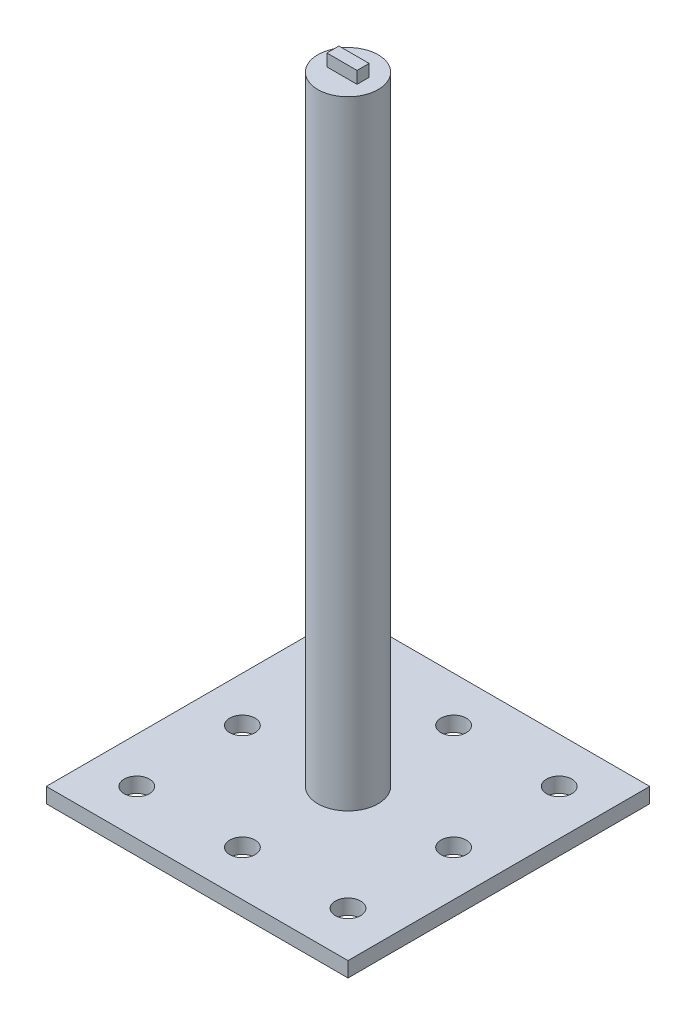
ISO-10303-21;
HEADER;
FILE_DESCRIPTION(('STEP AP214'),'2;1');
FILE_NAME('part.step','',(''),(''),'','','');
FILE_SCHEMA(('AUTOMOTIVE_DESIGN { 1 0 10303 214 1 1 1 1 }'));
ENDSEC;
DATA;
#1=APPLICATION_CONTEXT('core data for automotive mechanical design processes');
#2=APPLICATION_PROTOCOL_DEFINITION('international standard','automotive_design',2000,#1);
#3=PRODUCT_CONTEXT('',#1,'mechanical');
#4=PRODUCT('Part','Part','',(#3));
#5=PRODUCT_RELATED_PRODUCT_CATEGORY('part','',(#4));
#6=PRODUCT_DEFINITION_FORMATION('','',#4);
#7=PRODUCT_DEFINITION_CONTEXT('part definition',#1,'design');
#8=PRODUCT_DEFINITION('design','',#6,#7);
#9=PRODUCT_DEFINITION_SHAPE('','',#8);
#10=(LENGTH_UNIT() NAMED_UNIT(*) SI_UNIT(.MILLI.,.METRE.));
#11=(NAMED_UNIT(*) PLANE_ANGLE_UNIT() SI_UNIT($,.RADIAN.));
#12=(NAMED_UNIT(*) SI_UNIT($,.STERADIAN.) SOLID_ANGLE_UNIT());
#13=UNCERTAINTY_MEASURE_WITH_UNIT(LENGTH_MEASURE(1.E-05),#10,'distance_accuracy_value','');
#14=(GEOMETRIC_REPRESENTATION_CONTEXT(3) GLOBAL_UNCERTAINTY_ASSIGNED_CONTEXT((#13)) GLOBAL_UNIT_ASSIGNED_CONTEXT((#10,
#11,#12)) REPRESENTATION_CONTEXT('',''));
#15=CARTESIAN_POINT('',(0.,0.,0.));
#16=DIRECTION('',(0.,0.,1.));
#17=DIRECTION('',(1.,0.,0.));
#18=AXIS2_PLACEMENT_3D('',#15,#16,#17);
#19=CARTESIAN_POINT('',(0.,102.5,0.));
#20=DIRECTION('',(0.,1.,0.));
#21=DIRECTION('',(0.,0.,1.));
#22=AXIS2_PLACEMENT_3D('',#19,#20,#21);
#23=PLANE('',#22);
#24=CARTESIAN_POINT('',(0.,102.5,0.));
#25=DIRECTION('',(0.,1.,0.));
#26=DIRECTION('',(0.,0.,1.));
#27=AXIS2_PLACEMENT_3D('',#24,#25,#26);
#28=CIRCLE('',#27,5.);
#29=CARTESIAN_POINT('',(0.,102.5,5.));
#30=VERTEX_POINT('',#29);
#31=EDGE_CURVE('E221',#30,#30,#28,.T.);
#32=ORIENTED_EDGE('',*,*,#31,.T.);
#33=EDGE_LOOP('',(#32));
#34=FACE_BOUND('',#33,.T.);
#35=DIRECTION('',(-1.,0.,0.));
#36=VECTOR('',#35,1.);
#37=CARTESIAN_POINT('',(-2.5,102.5,-1.));
#38=LINE('',#37,#36);
#39=CARTESIAN_POINT('',(2.5,102.5,-1.));
#40=VERTEX_POINT('',#39);
#41=CARTESIAN_POINT('',(-2.5,102.5,-1.));
#42=VERTEX_POINT('',#41);
#43=EDGE_CURVE('E479',#40,#42,#38,.T.);
#44=ORIENTED_EDGE('',*,*,#43,.F.);
#45=DIRECTION('',(0.,0.,-1.));
#46=VECTOR('',#45,1.);
#47=CARTESIAN_POINT('',(2.5,102.5,-1.));
#48=LINE('',#47,#46);
#49=CARTESIAN_POINT('',(2.5,102.5,1.));
#50=VERTEX_POINT('',#49);
#51=EDGE_CURVE('E141',#50,#40,#48,.T.);
#52=ORIENTED_EDGE('',*,*,#51,.F.);
#53=DIRECTION('',(1.,0.,0.));
#54=VECTOR('',#53,1.);
#55=CARTESIAN_POINT('',(-2.5,102.5,1.));
#56=LINE('',#55,#54);
#57=CARTESIAN_POINT('',(-2.5,102.5,1.));
#58=VERTEX_POINT('',#57);
#59=EDGE_CURVE('E137',#58,#50,#56,.T.);
#60=ORIENTED_EDGE('',*,*,#59,.F.);
#61=DIRECTION('',(0.,0.,1.));
#62=VECTOR('',#61,1.);
#63=CARTESIAN_POINT('',(-2.5,102.5,-1.));
#64=LINE('',#63,#62);
#65=EDGE_CURVE('E481',#42,#58,#64,.T.);
#66=ORIENTED_EDGE('',*,*,#65,.F.);
#67=EDGE_LOOP('',(#44,#52,#60,#66));
#68=FACE_BOUND('',#67,.T.);
#69=ADVANCED_FACE('F42',(#34,#68),#23,.T.);
#70=CARTESIAN_POINT('',(0.,100.,0.));
#71=DIRECTION('',(0.,-1.,0.));
#72=DIRECTION('',(0.,0.,-1.));
#73=AXIS2_PLACEMENT_3D('',#70,#71,#72);
#74=CYLINDRICAL_SURFACE('',#73,5.);
#75=CARTESIAN_POINT('',(0.,0.,0.));
#76=DIRECTION('',(0.,1.,0.));
#77=DIRECTION('',(0.,0.,1.));
#78=AXIS2_PLACEMENT_3D('',#75,#76,#77);
#79=CIRCLE('',#78,5.);
#80=CARTESIAN_POINT('',(0.,0.,5.));
#81=VERTEX_POINT('',#80);
#82=EDGE_CURVE('E218',#81,#81,#79,.T.);
#83=ORIENTED_EDGE('',*,*,#82,.T.);
#84=EDGE_LOOP('',(#83));
#85=FACE_BOUND('',#84,.T.);
#86=ORIENTED_EDGE('',*,*,#31,.F.);
#87=EDGE_LOOP('',(#86));
#88=FACE_BOUND('',#87,.T.);
#89=ADVANCED_FACE('F44',(#85,#88),#74,.T.);
#90=CARTESIAN_POINT('',(-25.,-2.5,25.));
#91=DIRECTION('',(1.,0.,0.));
#92=DIRECTION('',(0.,0.,-1.));
#93=AXIS2_PLACEMENT_3D('',#90,#91,#92);
#94=PLANE('',#93);
#95=DIRECTION('',(0.,0.,-1.));
#96=VECTOR('',#95,1.);
#97=CARTESIAN_POINT('',(-25.,0.,25.));
#98=LINE('',#97,#96);
#99=CARTESIAN_POINT('',(-25.,0.,25.));
#100=VERTEX_POINT('',#99);
#101=CARTESIAN_POINT('',(-25.,0.,-25.));
#102=VERTEX_POINT('',#101);
#103=EDGE_CURVE('E195',#100,#102,#98,.T.);
#104=ORIENTED_EDGE('',*,*,#103,.T.);
#105=DIRECTION('',(0.,1.,0.));
#106=VECTOR('',#105,1.);
#107=CARTESIAN_POINT('',(-25.,-2.5,-25.));
#108=LINE('',#107,#106);
#109=CARTESIAN_POINT('',(-25.,-2.5,-25.));
#110=VERTEX_POINT('',#109);
#111=EDGE_CURVE('E216',#110,#102,#108,.T.);
#112=ORIENTED_EDGE('',*,*,#111,.F.);
#113=DIRECTION('',(0.,0.,-1.));
#114=VECTOR('',#113,1.);
#115=CARTESIAN_POINT('',(-25.,-2.5,25.));
#116=LINE('',#115,#114);
#117=CARTESIAN_POINT('',(-25.,-2.5,25.));
#118=VERTEX_POINT('',#117);
#119=EDGE_CURVE('E196',#118,#110,#116,.T.);
#120=ORIENTED_EDGE('',*,*,#119,.F.);
#121=DIRECTION('',(0.,1.,0.));
#122=VECTOR('',#121,1.);
#123=CARTESIAN_POINT('',(-25.,-2.5,25.));
#124=LINE('',#123,#122);
#125=EDGE_CURVE('E202',#118,#100,#124,.T.);
#126=ORIENTED_EDGE('',*,*,#125,.T.);
#127=EDGE_LOOP('',(#104,#112,#120,#126));
#128=FACE_BOUND('',#127,.T.);
#129=ADVANCED_FACE('F245',(#128),#94,.F.);
#130=CARTESIAN_POINT('',(25.,-2.5,-25.));
#131=DIRECTION('',(0.,0.,1.));
#132=DIRECTION('',(1.,0.,0.));
#133=AXIS2_PLACEMENT_3D('',#130,#131,#132);
#134=PLANE('',#133);
#135=DIRECTION('',(1.,0.,0.));
#136=VECTOR('',#135,1.);
#137=CARTESIAN_POINT('',(25.,0.,-25.));
#138=LINE('',#137,#136);
#139=CARTESIAN_POINT('',(25.,0.,-25.));
#140=VERTEX_POINT('',#139);
#141=EDGE_CURVE('E205',#102,#140,#138,.T.);
#142=ORIENTED_EDGE('',*,*,#141,.T.);
#143=DIRECTION('',(0.,1.,0.));
#144=VECTOR('',#143,1.);
#145=CARTESIAN_POINT('',(25.,-2.5,-25.));
#146=LINE('',#145,#144);
#147=CARTESIAN_POINT('',(25.,-2.5,-25.));
#148=VERTEX_POINT('',#147);
#149=EDGE_CURVE('E213',#148,#140,#146,.T.);
#150=ORIENTED_EDGE('',*,*,#149,.F.);
#151=DIRECTION('',(1.,0.,0.));
#152=VECTOR('',#151,1.);
#153=CARTESIAN_POINT('',(25.,-2.5,-25.));
#154=LINE('',#153,#152);
#155=EDGE_CURVE('E96',#110,#148,#154,.T.);
#156=ORIENTED_EDGE('',*,*,#155,.F.);
#157=ORIENTED_EDGE('',*,*,#111,.T.);
#158=EDGE_LOOP('',(#142,#150,#156,#157));
#159=FACE_BOUND('',#158,.T.);
#160=ADVANCED_FACE('F248',(#159),#134,.F.);
#161=CARTESIAN_POINT('',(25.,-2.5,25.));
#162=DIRECTION('',(-1.,0.,0.));
#163=DIRECTION('',(0.,0.,1.));
#164=AXIS2_PLACEMENT_3D('',#161,#162,#163);
#165=PLANE('',#164);
#166=DIRECTION('',(0.,0.,1.));
#167=VECTOR('',#166,1.);
#168=CARTESIAN_POINT('',(25.,0.,25.));
#169=LINE('',#168,#167);
#170=CARTESIAN_POINT('',(25.,0.,25.));
#171=VERTEX_POINT('',#170);
#172=EDGE_CURVE('E207',#140,#171,#169,.T.);
#173=ORIENTED_EDGE('',*,*,#172,.T.);
#174=DIRECTION('',(0.,1.,0.));
#175=VECTOR('',#174,1.);
#176=CARTESIAN_POINT('',(25.,-2.5,25.));
#177=LINE('',#176,#175);
#178=CARTESIAN_POINT('',(25.,-2.5,25.));
#179=VERTEX_POINT('',#178);
#180=EDGE_CURVE('E211',#179,#171,#177,.T.);
#181=ORIENTED_EDGE('',*,*,#180,.F.);
#182=DIRECTION('',(0.,0.,1.));
#183=VECTOR('',#182,1.);
#184=CARTESIAN_POINT('',(25.,-2.5,25.));
#185=LINE('',#184,#183);
#186=EDGE_CURVE('E199',#148,#179,#185,.T.);
#187=ORIENTED_EDGE('',*,*,#186,.F.);
#188=ORIENTED_EDGE('',*,*,#149,.T.);
#189=EDGE_LOOP('',(#173,#181,#187,#188));
#190=FACE_BOUND('',#189,.T.);
#191=ADVANCED_FACE('F252',(#190),#165,.F.);
#192=CARTESIAN_POINT('',(25.,-2.5,25.));
#193=DIRECTION('',(0.,0.,-1.));
#194=DIRECTION('',(-1.,0.,0.));
#195=AXIS2_PLACEMENT_3D('',#192,#193,#194);
#196=PLANE('',#195);
#197=DIRECTION('',(-1.,0.,0.));
#198=VECTOR('',#197,1.);
#199=CARTESIAN_POINT('',(25.,0.,25.));
#200=LINE('',#199,#198);
#201=EDGE_CURVE('E88',#171,#100,#200,.T.);
#202=ORIENTED_EDGE('',*,*,#201,.T.);
#203=ORIENTED_EDGE('',*,*,#125,.F.);
#204=DIRECTION('',(-1.,0.,0.));
#205=VECTOR('',#204,1.);
#206=CARTESIAN_POINT('',(25.,-2.5,25.));
#207=LINE('',#206,#205);
#208=EDGE_CURVE('E67',#179,#118,#207,.T.);
#209=ORIENTED_EDGE('',*,*,#208,.F.);
#210=ORIENTED_EDGE('',*,*,#180,.T.);
#211=EDGE_LOOP('',(#202,#203,#209,#210));
#212=FACE_BOUND('',#211,.T.);
#213=ADVANCED_FACE('F255',(#212),#196,.F.);
#214=CARTESIAN_POINT('',(0.,-2.5,0.));
#215=DIRECTION('',(0.,1.,0.));
#216=DIRECTION('',(0.,0.,1.));
#217=AXIS2_PLACEMENT_3D('',#214,#215,#216);
#218=PLANE('',#217);
#219=CARTESIAN_POINT('',(-17.5,-2.5,0.));
#220=DIRECTION('',(0.,1.,0.));
#221=DIRECTION('',(0.,0.,1.));
#222=AXIS2_PLACEMENT_3D('',#219,#220,#221);
#223=CIRCLE('',#222,2.09999999999999);
#224=CARTESIAN_POINT('',(-17.5,-2.5,2.09999999999999));
#225=VERTEX_POINT('',#224);
#226=EDGE_CURVE('E146',#225,#225,#223,.T.);
#227=ORIENTED_EDGE('',*,*,#226,.T.);
#228=EDGE_LOOP('',(#227));
#229=FACE_BOUND('',#228,.T.);
#230=CARTESIAN_POINT('',(-17.5,-2.5,17.5));
#231=DIRECTION('',(0.,1.,0.));
#232=DIRECTION('',(0.,0.,1.));
#233=AXIS2_PLACEMENT_3D('',#230,#231,#232);
#234=CIRCLE('',#233,2.09999999999999);
#235=CARTESIAN_POINT('',(-17.5,-2.5,19.6));
#236=VERTEX_POINT('',#235);
#237=EDGE_CURVE('E156',#236,#236,#234,.T.);
#238=ORIENTED_EDGE('',*,*,#237,.T.);
#239=EDGE_LOOP('',(#238));
#240=FACE_BOUND('',#239,.T.);
#241=CARTESIAN_POINT('',(0.,-2.5,17.5));
#242=DIRECTION('',(0.,1.,0.));
#243=DIRECTION('',(0.,0.,1.));
#244=AXIS2_PLACEMENT_3D('',#241,#242,#243);
#245=CIRCLE('',#244,2.09999999999999);
#246=CARTESIAN_POINT('',(0.,-2.5,19.6));
#247=VERTEX_POINT('',#246);
#248=EDGE_CURVE('E162',#247,#247,#245,.T.);
#249=ORIENTED_EDGE('',*,*,#248,.T.);
#250=EDGE_LOOP('',(#249));
#251=FACE_BOUND('',#250,.T.);
#252=CARTESIAN_POINT('',(17.5,-2.5,17.5));
#253=DIRECTION('',(0.,1.,0.));
#254=DIRECTION('',(0.,0.,1.));
#255=AXIS2_PLACEMENT_3D('',#252,#253,#254);
#256=CIRCLE('',#255,2.09999999999999);
#257=CARTESIAN_POINT('',(17.5,-2.5,19.6));
#258=VERTEX_POINT('',#257);
#259=EDGE_CURVE('E168',#258,#258,#256,.T.);
#260=ORIENTED_EDGE('',*,*,#259,.T.);
#261=EDGE_LOOP('',(#260));
#262=FACE_BOUND('',#261,.T.);
#263=CARTESIAN_POINT('',(17.5,-2.5,0.));
#264=DIRECTION('',(0.,1.,0.));
#265=DIRECTION('',(0.,0.,1.));
#266=AXIS2_PLACEMENT_3D('',#263,#264,#265);
#267=CIRCLE('',#266,2.09999999999999);
#268=CARTESIAN_POINT('',(17.5,-2.5,2.09999999999998));
#269=VERTEX_POINT('',#268);
#270=EDGE_CURVE('E174',#269,#269,#267,.T.);
#271=ORIENTED_EDGE('',*,*,#270,.T.);
#272=EDGE_LOOP('',(#271));
#273=FACE_BOUND('',#272,.T.);
#274=CARTESIAN_POINT('',(17.5,-2.5,-17.5));
#275=DIRECTION('',(0.,1.,0.));
#276=DIRECTION('',(0.,0.,1.));
#277=AXIS2_PLACEMENT_3D('',#274,#275,#276);
#278=CIRCLE('',#277,2.09999999999999);
#279=CARTESIAN_POINT('',(17.5,-2.5,-15.4));
#280=VERTEX_POINT('',#279);
#281=EDGE_CURVE('E180',#280,#280,#278,.T.);
#282=ORIENTED_EDGE('',*,*,#281,.T.);
#283=EDGE_LOOP('',(#282));
#284=FACE_BOUND('',#283,.T.);
#285=CARTESIAN_POINT('',(0.,-2.5,-17.5));
#286=DIRECTION('',(0.,1.,0.));
#287=DIRECTION('',(0.,0.,1.));
#288=AXIS2_PLACEMENT_3D('',#285,#286,#287);
#289=CIRCLE('',#288,2.09999999999999);
#290=CARTESIAN_POINT('',(0.,-2.5,-15.4));
#291=VERTEX_POINT('',#290);
#292=EDGE_CURVE('E186',#291,#291,#289,.T.);
#293=ORIENTED_EDGE('',*,*,#292,.T.);
#294=EDGE_LOOP('',(#293));
#295=FACE_BOUND('',#294,.T.);
#296=CARTESIAN_POINT('',(-17.5,-2.5,-17.5));
#297=DIRECTION('',(0.,1.,0.));
#298=DIRECTION('',(0.,0.,1.));
#299=AXIS2_PLACEMENT_3D('',#296,#297,#298);
#300=CIRCLE('',#299,2.09999999999999);
#301=CARTESIAN_POINT('',(-17.5,-2.5,-15.4));
#302=VERTEX_POINT('',#301);
#303=EDGE_CURVE('E192',#302,#302,#300,.T.);
#304=ORIENTED_EDGE('',*,*,#303,.T.);
#305=EDGE_LOOP('',(#304));
#306=FACE_BOUND('',#305,.T.);
#307=ORIENTED_EDGE('',*,*,#119,.T.);
#308=ORIENTED_EDGE('',*,*,#155,.T.);
#309=ORIENTED_EDGE('',*,*,#186,.T.);
#310=ORIENTED_EDGE('',*,*,#208,.T.);
#311=EDGE_LOOP('',(#307,#308,#309,#310));
#312=FACE_BOUND('',#311,.T.);
#313=ADVANCED_FACE('F258',(#229,#240,#251,#262,#273,#284,#295,#306,#312),#218,.F.);
#314=CARTESIAN_POINT('',(0.,0.,0.));
#315=DIRECTION('',(0.,1.,0.));
#316=DIRECTION('',(0.,0.,1.));
#317=AXIS2_PLACEMENT_3D('',#314,#315,#316);
#318=PLANE('',#317);
#319=CARTESIAN_POINT('',(-17.5,0.,0.));
#320=DIRECTION('',(0.,1.,0.));
#321=DIRECTION('',(0.,0.,1.));
#322=AXIS2_PLACEMENT_3D('',#319,#320,#321);
#323=CIRCLE('',#322,2.09999999999999);
#324=CARTESIAN_POINT('',(-17.5,0.,2.09999999999999));
#325=VERTEX_POINT('',#324);
#326=EDGE_CURVE('E143',#325,#325,#323,.T.);
#327=ORIENTED_EDGE('',*,*,#326,.F.);
#328=EDGE_LOOP('',(#327));
#329=FACE_BOUND('',#328,.T.);
#330=CARTESIAN_POINT('',(-17.5,0.,17.5));
#331=DIRECTION('',(0.,1.,0.));
#332=DIRECTION('',(0.,0.,1.));
#333=AXIS2_PLACEMENT_3D('',#330,#331,#332);
#334=CIRCLE('',#333,2.09999999999999);
#335=CARTESIAN_POINT('',(-17.5,0.,19.6));
#336=VERTEX_POINT('',#335);
#337=EDGE_CURVE('E153',#336,#336,#334,.T.);
#338=ORIENTED_EDGE('',*,*,#337,.F.);
#339=EDGE_LOOP('',(#338));
#340=FACE_BOUND('',#339,.T.);
#341=CARTESIAN_POINT('',(0.,0.,17.5));
#342=DIRECTION('',(0.,1.,0.));
#343=DIRECTION('',(0.,0.,1.));
#344=AXIS2_PLACEMENT_3D('',#341,#342,#343);
#345=CIRCLE('',#344,2.09999999999999);
#346=CARTESIAN_POINT('',(0.,0.,19.6));
#347=VERTEX_POINT('',#346);
#348=EDGE_CURVE('E159',#347,#347,#345,.T.);
#349=ORIENTED_EDGE('',*,*,#348,.F.);
#350=EDGE_LOOP('',(#349));
#351=FACE_BOUND('',#350,.T.);
#352=CARTESIAN_POINT('',(17.5,0.,17.5));
#353=DIRECTION('',(0.,1.,0.));
#354=DIRECTION('',(0.,0.,1.));
#355=AXIS2_PLACEMENT_3D('',#352,#353,#354);
#356=CIRCLE('',#355,2.09999999999999);
#357=CARTESIAN_POINT('',(17.5,0.,19.6));
#358=VERTEX_POINT('',#357);
#359=EDGE_CURVE('E165',#358,#358,#356,.T.);
#360=ORIENTED_EDGE('',*,*,#359,.F.);
#361=EDGE_LOOP('',(#360));
#362=FACE_BOUND('',#361,.T.);
#363=CARTESIAN_POINT('',(17.5,0.,0.));
#364=DIRECTION('',(0.,1.,0.));
#365=DIRECTION('',(0.,0.,1.));
#366=AXIS2_PLACEMENT_3D('',#363,#364,#365);
#367=CIRCLE('',#366,2.09999999999999);
#368=CARTESIAN_POINT('',(17.5,0.,2.09999999999999));
#369=VERTEX_POINT('',#368);
#370=EDGE_CURVE('E171',#369,#369,#367,.T.);
#371=ORIENTED_EDGE('',*,*,#370,.F.);
#372=EDGE_LOOP('',(#371));
#373=FACE_BOUND('',#372,.T.);
#374=CARTESIAN_POINT('',(17.5,0.,-17.5));
#375=DIRECTION('',(0.,1.,0.));
#376=DIRECTION('',(0.,0.,1.));
#377=AXIS2_PLACEMENT_3D('',#374,#375,#376);
#378=CIRCLE('',#377,2.09999999999999);
#379=CARTESIAN_POINT('',(17.5,0.,-15.4));
#380=VERTEX_POINT('',#379);
#381=EDGE_CURVE('E177',#380,#380,#378,.T.);
#382=ORIENTED_EDGE('',*,*,#381,.F.);
#383=EDGE_LOOP('',(#382));
#384=FACE_BOUND('',#383,.T.);
#385=CARTESIAN_POINT('',(0.,0.,-17.5));
#386=DIRECTION('',(0.,1.,0.));
#387=DIRECTION('',(0.,0.,1.));
#388=AXIS2_PLACEMENT_3D('',#385,#386,#387);
#389=CIRCLE('',#388,2.09999999999999);
#390=CARTESIAN_POINT('',(0.,0.,-15.4));
#391=VERTEX_POINT('',#390);
#392=EDGE_CURVE('E183',#391,#391,#389,.T.);
#393=ORIENTED_EDGE('',*,*,#392,.F.);
#394=EDGE_LOOP('',(#393));
#395=FACE_BOUND('',#394,.T.);
#396=CARTESIAN_POINT('',(-17.5,0.,-17.5));
#397=DIRECTION('',(0.,1.,0.));
#398=DIRECTION('',(0.,0.,1.));
#399=AXIS2_PLACEMENT_3D('',#396,#397,#398);
#400=CIRCLE('',#399,2.09999999999999);
#401=CARTESIAN_POINT('',(-17.5,0.,-15.4));
#402=VERTEX_POINT('',#401);
#403=EDGE_CURVE('E189',#402,#402,#400,.T.);
#404=ORIENTED_EDGE('',*,*,#403,.F.);
#405=EDGE_LOOP('',(#404));
#406=FACE_BOUND('',#405,.T.);
#407=ORIENTED_EDGE('',*,*,#82,.F.);
#408=EDGE_LOOP('',(#407));
#409=FACE_BOUND('',#408,.T.);
#410=ORIENTED_EDGE('',*,*,#103,.F.);
#411=ORIENTED_EDGE('',*,*,#201,.F.);
#412=ORIENTED_EDGE('',*,*,#172,.F.);
#413=ORIENTED_EDGE('',*,*,#141,.F.);
#414=EDGE_LOOP('',(#410,#411,#412,#413));
#415=FACE_BOUND('',#414,.T.);
#416=ADVANCED_FACE('F240',(#329,#340,#351,#362,#373,#384,#395,#406,#409,#415),#318,.T.);
#417=CARTESIAN_POINT('',(-17.5,0.,-17.5));
#418=DIRECTION('',(0.,1.,0.));
#419=DIRECTION('',(0.,0.,1.));
#420=AXIS2_PLACEMENT_3D('',#417,#418,#419);
#421=CYLINDRICAL_SURFACE('',#420,2.09999999999999);
#422=ORIENTED_EDGE('',*,*,#403,.T.);
#423=EDGE_LOOP('',(#422));
#424=FACE_BOUND('',#423,.T.);
#425=ORIENTED_EDGE('',*,*,#303,.F.);
#426=EDGE_LOOP('',(#425));
#427=FACE_BOUND('',#426,.T.);
#428=ADVANCED_FACE('F261',(#424,#427),#421,.F.);
#429=CARTESIAN_POINT('',(0.,0.,-17.5));
#430=DIRECTION('',(0.,1.,0.));
#431=DIRECTION('',(0.,0.,1.));
#432=AXIS2_PLACEMENT_3D('',#429,#430,#431);
#433=CYLINDRICAL_SURFACE('',#432,2.09999999999999);
#434=ORIENTED_EDGE('',*,*,#392,.T.);
#435=EDGE_LOOP('',(#434));
#436=FACE_BOUND('',#435,.T.);
#437=ORIENTED_EDGE('',*,*,#292,.F.);
#438=EDGE_LOOP('',(#437));
#439=FACE_BOUND('',#438,.T.);
#440=ADVANCED_FACE('F268',(#436,#439),#433,.F.);
#441=CARTESIAN_POINT('',(17.5,0.,-17.5));
#442=DIRECTION('',(0.,1.,0.));
#443=DIRECTION('',(0.,0.,1.));
#444=AXIS2_PLACEMENT_3D('',#441,#442,#443);
#445=CYLINDRICAL_SURFACE('',#444,2.09999999999999);
#446=ORIENTED_EDGE('',*,*,#381,.T.);
#447=EDGE_LOOP('',(#446));
#448=FACE_BOUND('',#447,.T.);
#449=ORIENTED_EDGE('',*,*,#281,.F.);
#450=EDGE_LOOP('',(#449));
#451=FACE_BOUND('',#450,.T.);
#452=ADVANCED_FACE('F272',(#448,#451),#445,.F.);
#453=CARTESIAN_POINT('',(17.5,0.,0.));
#454=DIRECTION('',(0.,1.,0.));
#455=DIRECTION('',(0.,0.,1.));
#456=AXIS2_PLACEMENT_3D('',#453,#454,#455);
#457=CYLINDRICAL_SURFACE('',#456,2.09999999999999);
#458=ORIENTED_EDGE('',*,*,#370,.T.);
#459=EDGE_LOOP('',(#458));
#460=FACE_BOUND('',#459,.T.);
#461=ORIENTED_EDGE('',*,*,#270,.F.);
#462=EDGE_LOOP('',(#461));
#463=FACE_BOUND('',#462,.T.);
#464=ADVANCED_FACE('F276',(#460,#463),#457,.F.);
#465=CARTESIAN_POINT('',(17.5,0.,17.5));
#466=DIRECTION('',(0.,1.,0.));
#467=DIRECTION('',(0.,0.,1.));
#468=AXIS2_PLACEMENT_3D('',#465,#466,#467);
#469=CYLINDRICAL_SURFACE('',#468,2.09999999999999);
#470=ORIENTED_EDGE('',*,*,#359,.T.);
#471=EDGE_LOOP('',(#470));
#472=FACE_BOUND('',#471,.T.);
#473=ORIENTED_EDGE('',*,*,#259,.F.);
#474=EDGE_LOOP('',(#473));
#475=FACE_BOUND('',#474,.T.);
#476=ADVANCED_FACE('F280',(#472,#475),#469,.F.);
#477=CARTESIAN_POINT('',(0.,0.,17.5));
#478=DIRECTION('',(0.,1.,0.));
#479=DIRECTION('',(0.,0.,1.));
#480=AXIS2_PLACEMENT_3D('',#477,#478,#479);
#481=CYLINDRICAL_SURFACE('',#480,2.09999999999999);
#482=ORIENTED_EDGE('',*,*,#348,.T.);
#483=EDGE_LOOP('',(#482));
#484=FACE_BOUND('',#483,.T.);
#485=ORIENTED_EDGE('',*,*,#248,.F.);
#486=EDGE_LOOP('',(#485));
#487=FACE_BOUND('',#486,.T.);
#488=ADVANCED_FACE('F284',(#484,#487),#481,.F.);
#489=CARTESIAN_POINT('',(-17.5,0.,17.5));
#490=DIRECTION('',(0.,1.,0.));
#491=DIRECTION('',(0.,0.,1.));
#492=AXIS2_PLACEMENT_3D('',#489,#490,#491);
#493=CYLINDRICAL_SURFACE('',#492,2.09999999999999);
#494=ORIENTED_EDGE('',*,*,#337,.T.);
#495=EDGE_LOOP('',(#494));
#496=FACE_BOUND('',#495,.T.);
#497=ORIENTED_EDGE('',*,*,#237,.F.);
#498=EDGE_LOOP('',(#497));
#499=FACE_BOUND('',#498,.T.);
#500=ADVANCED_FACE('F288',(#496,#499),#493,.F.);
#501=CARTESIAN_POINT('',(-17.5,0.,0.));
#502=DIRECTION('',(0.,1.,0.));
#503=DIRECTION('',(0.,0.,1.));
#504=AXIS2_PLACEMENT_3D('',#501,#502,#503);
#505=CYLINDRICAL_SURFACE('',#504,2.09999999999999);
#506=ORIENTED_EDGE('',*,*,#326,.T.);
#507=EDGE_LOOP('',(#506));
#508=FACE_BOUND('',#507,.T.);
#509=ORIENTED_EDGE('',*,*,#226,.F.);
#510=EDGE_LOOP('',(#509));
#511=FACE_BOUND('',#510,.T.);
#512=ADVANCED_FACE('F292',(#508,#511),#505,.F.);
#513=CARTESIAN_POINT('',(2.5,104.5,-1.));
#514=DIRECTION('',(-1.,0.,0.));
#515=DIRECTION('',(0.,0.,1.));
#516=AXIS2_PLACEMENT_3D('',#513,#514,#515);
#517=PLANE('',#516);
#518=ORIENTED_EDGE('',*,*,#51,.T.);
#519=DIRECTION('',(0.,-1.,0.));
#520=VECTOR('',#519,1.);
#521=CARTESIAN_POINT('',(2.5,104.5,-1.));
#522=LINE('',#521,#520);
#523=CARTESIAN_POINT('',(2.5,104.5,-1.));
#524=VERTEX_POINT('',#523);
#525=EDGE_CURVE('E122',#524,#40,#522,.T.);
#526=ORIENTED_EDGE('',*,*,#525,.F.);
#527=DIRECTION('',(0.,0.,-1.));
#528=VECTOR('',#527,1.);
#529=CARTESIAN_POINT('',(2.5,104.5,-1.));
#530=LINE('',#529,#528);
#531=CARTESIAN_POINT('',(2.5,104.5,1.));
#532=VERTEX_POINT('',#531);
#533=EDGE_CURVE('E129',#532,#524,#530,.T.);
#534=ORIENTED_EDGE('',*,*,#533,.F.);
#535=DIRECTION('',(0.,-1.,0.));
#536=VECTOR('',#535,1.);
#537=CARTESIAN_POINT('',(2.5,104.5,1.));
#538=LINE('',#537,#536);
#539=EDGE_CURVE('E488',#532,#50,#538,.T.);
#540=ORIENTED_EDGE('',*,*,#539,.T.);
#541=EDGE_LOOP('',(#518,#526,#534,#540));
#542=FACE_BOUND('',#541,.T.);
#543=ADVANCED_FACE('F139',(#542),#517,.F.);
#544=CARTESIAN_POINT('',(-2.5,104.5,-1.));
#545=DIRECTION('',(0.,0.,1.));
#546=DIRECTION('',(1.,0.,0.));
#547=AXIS2_PLACEMENT_3D('',#544,#545,#546);
#548=PLANE('',#547);
#549=ORIENTED_EDGE('',*,*,#43,.T.);
#550=DIRECTION('',(0.,-1.,0.));
#551=VECTOR('',#550,1.);
#552=CARTESIAN_POINT('',(-2.5,104.5,-1.));
#553=LINE('',#552,#551);
#554=CARTESIAN_POINT('',(-2.5,104.5,-1.));
#555=VERTEX_POINT('',#554);
#556=EDGE_CURVE('E125',#555,#42,#553,.T.);
#557=ORIENTED_EDGE('',*,*,#556,.F.);
#558=DIRECTION('',(-1.,0.,0.));
#559=VECTOR('',#558,1.);
#560=CARTESIAN_POINT('',(-2.5,104.5,-1.));
#561=LINE('',#560,#559);
#562=EDGE_CURVE('E118',#524,#555,#561,.T.);
#563=ORIENTED_EDGE('',*,*,#562,.F.);
#564=ORIENTED_EDGE('',*,*,#525,.T.);
#565=EDGE_LOOP('',(#549,#557,#563,#564));
#566=FACE_BOUND('',#565,.T.);
#567=ADVANCED_FACE('F120',(#566),#548,.F.);
#568=CARTESIAN_POINT('',(-2.5,104.5,-1.));
#569=DIRECTION('',(1.,0.,0.));
#570=DIRECTION('',(0.,0.,-1.));
#571=AXIS2_PLACEMENT_3D('',#568,#569,#570);
#572=PLANE('',#571);
#573=ORIENTED_EDGE('',*,*,#65,.T.);
#574=DIRECTION('',(0.,-1.,0.));
#575=VECTOR('',#574,1.);
#576=CARTESIAN_POINT('',(-2.5,104.5,1.));
#577=LINE('',#576,#575);
#578=CARTESIAN_POINT('',(-2.5,104.5,1.));
#579=VERTEX_POINT('',#578);
#580=EDGE_CURVE('E58',#579,#58,#577,.T.);
#581=ORIENTED_EDGE('',*,*,#580,.F.);
#582=DIRECTION('',(0.,0.,1.));
#583=VECTOR('',#582,1.);
#584=CARTESIAN_POINT('',(-2.5,104.5,-1.));
#585=LINE('',#584,#583);
#586=EDGE_CURVE('E128',#555,#579,#585,.T.);
#587=ORIENTED_EDGE('',*,*,#586,.F.);
#588=ORIENTED_EDGE('',*,*,#556,.T.);
#589=EDGE_LOOP('',(#573,#581,#587,#588));
#590=FACE_BOUND('',#589,.T.);
#591=ADVANCED_FACE('F301',(#590),#572,.F.);
#592=CARTESIAN_POINT('',(-2.5,104.5,1.));
#593=DIRECTION('',(0.,0.,-1.));
#594=DIRECTION('',(-1.,0.,0.));
#595=AXIS2_PLACEMENT_3D('',#592,#593,#594);
#596=PLANE('',#595);
#597=ORIENTED_EDGE('',*,*,#59,.T.);
#598=ORIENTED_EDGE('',*,*,#539,.F.);
#599=DIRECTION('',(1.,0.,0.));
#600=VECTOR('',#599,1.);
#601=CARTESIAN_POINT('',(-2.5,104.5,1.));
#602=LINE('',#601,#600);
#603=EDGE_CURVE('E133',#579,#532,#602,.T.);
#604=ORIENTED_EDGE('',*,*,#603,.F.);
#605=ORIENTED_EDGE('',*,*,#580,.T.);
#606=EDGE_LOOP('',(#597,#598,#604,#605));
#607=FACE_BOUND('',#606,.T.);
#608=ADVANCED_FACE('F304',(#607),#596,.F.);
#609=CARTESIAN_POINT('',(0.,104.5,0.));
#610=DIRECTION('',(0.,1.,0.));
#611=DIRECTION('',(0.,0.,1.));
#612=AXIS2_PLACEMENT_3D('',#609,#610,#611);
#613=PLANE('',#612);
#614=ORIENTED_EDGE('',*,*,#533,.T.);
#615=ORIENTED_EDGE('',*,*,#562,.T.);
#616=ORIENTED_EDGE('',*,*,#586,.T.);
#617=ORIENTED_EDGE('',*,*,#603,.T.);
#618=EDGE_LOOP('',(#614,#615,#616,#617));
#619=FACE_BOUND('',#618,.T.);
#620=ADVANCED_FACE('F132',(#619),#613,.T.);
#621=CLOSED_SHELL('',(#69,#89,#129,#160,#191,#213,#313,#416,#428,#440,#452,#464,#476,#488,#500,
#512,#543,#567,#591,#608,#620));
#622=CARTESIAN_POINT('',(0.,0.,0.));
#623=DIRECTION('',(0.,1.,0.));
#624=DIRECTION('',(0.,0.,1.));
#625=AXIS2_PLACEMENT_3D('',#622,#623,#624);
#626=CIRCLE('',#625,4.5);
#627=CARTESIAN_POINT('',(0.,0.,4.5));
#628=VERTEX_POINT('',#627);
#629=EDGE_CURVE('E11',#628,#628,#626,.T.);
#630=ORIENTED_EDGE('',*,*,#629,.T.);
#631=EDGE_LOOP('',(#630));
#632=FACE_BOUND('',#631,.T.);
#633=ADVANCED_FACE('F231',(#632),#318,.T.);
#634=CARTESIAN_POINT('',(0.,100.,0.));
#635=DIRECTION('',(0.,1.,0.));
#636=DIRECTION('',(0.,0.,1.));
#637=AXIS2_PLACEMENT_3D('',#634,#635,#636);
#638=PLANE('',#637);
#639=CARTESIAN_POINT('',(0.,100.,0.));
#640=DIRECTION('',(0.,1.,0.));
#641=DIRECTION('',(0.,0.,1.));
#642=AXIS2_PLACEMENT_3D('',#639,#640,#641);
#643=CIRCLE('',#642,4.5);
#644=CARTESIAN_POINT('',(0.,100.,4.5));
#645=VERTEX_POINT('',#644);
#646=EDGE_CURVE('E51',#645,#645,#643,.T.);
#647=ORIENTED_EDGE('',*,*,#646,.F.);
#648=EDGE_LOOP('',(#647));
#649=FACE_BOUND('',#648,.T.);
#650=ADVANCED_FACE('F229',(#649),#638,.F.);
#651=CARTESIAN_POINT('',(0.,100.,0.));
#652=DIRECTION('',(0.,-1.,0.));
#653=DIRECTION('',(0.,0.,-1.));
#654=AXIS2_PLACEMENT_3D('',#651,#652,#653);
#655=CYLINDRICAL_SURFACE('',#654,4.5);
#656=ORIENTED_EDGE('',*,*,#646,.T.);
#657=EDGE_LOOP('',(#656));
#658=FACE_BOUND('',#657,.T.);
#659=ORIENTED_EDGE('',*,*,#629,.F.);
#660=EDGE_LOOP('',(#659));
#661=FACE_BOUND('',#660,.T.);
#662=ADVANCED_FACE('F226',(#658,#661),#655,.F.);
#663=CLOSED_SHELL('',(#633,#650,#662));
#664=ORIENTED_CLOSED_SHELL('',*,#663,.T.);
#665=BREP_WITH_VOIDS('B2',#621,(#664));
#666=ADVANCED_BREP_SHAPE_REPRESENTATION('',(#18,#665),#14);
#667=SHAPE_DEFINITION_REPRESENTATION(#9,#666);
ENDSEC;
END-ISO-10303-21;
